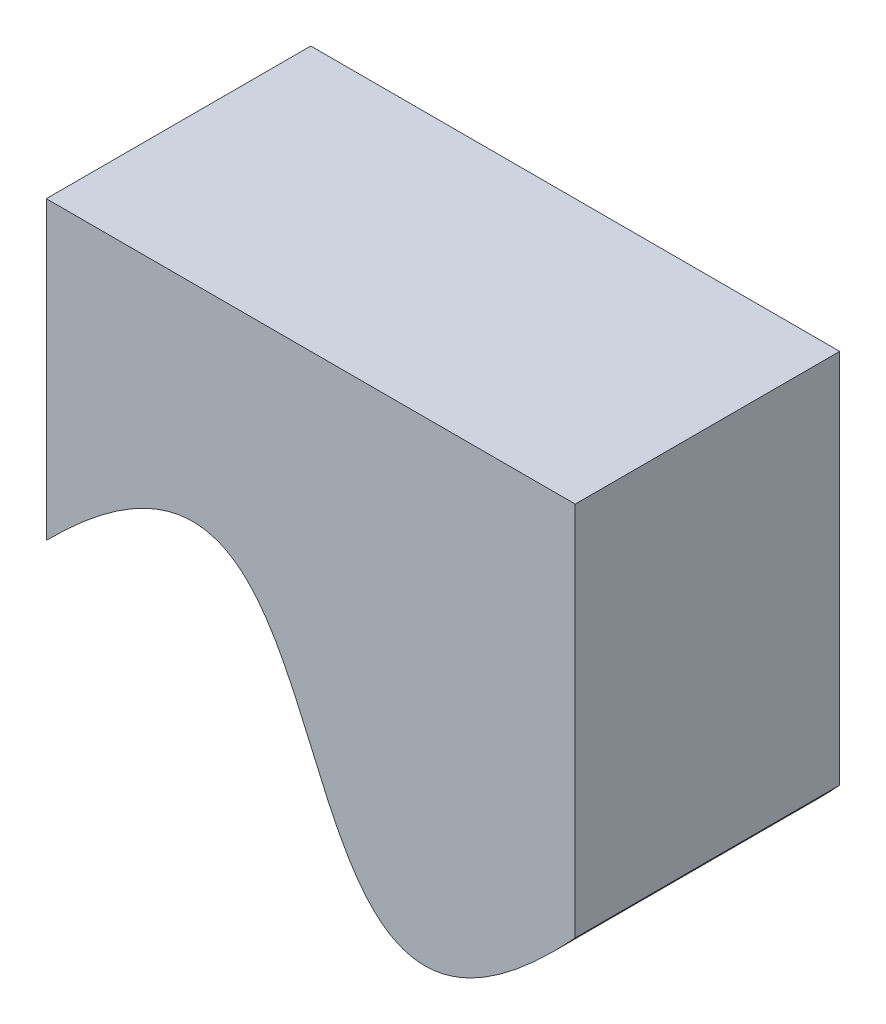
ISO-10303-21;
HEADER;
FILE_DESCRIPTION(('STEP AP214'),'2;1');
FILE_NAME('part.step','',(''),(''),'','','');
FILE_SCHEMA(('AUTOMOTIVE_DESIGN { 1 0 10303 214 1 1 1 1 }'));
ENDSEC;
DATA;
#1=APPLICATION_CONTEXT('core data for automotive mechanical design processes');
#2=APPLICATION_PROTOCOL_DEFINITION('international standard','automotive_design',2000,#1);
#3=PRODUCT_CONTEXT('',#1,'mechanical');
#4=PRODUCT('Part','Part','',(#3));
#5=PRODUCT_RELATED_PRODUCT_CATEGORY('part','',(#4));
#6=PRODUCT_DEFINITION_FORMATION('','',#4);
#7=PRODUCT_DEFINITION_CONTEXT('part definition',#1,'design');
#8=PRODUCT_DEFINITION('design','',#6,#7);
#9=PRODUCT_DEFINITION_SHAPE('','',#8);
#10=(LENGTH_UNIT() NAMED_UNIT(*) SI_UNIT(.MILLI.,.METRE.));
#11=(NAMED_UNIT(*) PLANE_ANGLE_UNIT() SI_UNIT($,.RADIAN.));
#12=(NAMED_UNIT(*) SI_UNIT($,.STERADIAN.) SOLID_ANGLE_UNIT());
#13=UNCERTAINTY_MEASURE_WITH_UNIT(LENGTH_MEASURE(1.E-05),#10,'distance_accuracy_value','');
#14=(GEOMETRIC_REPRESENTATION_CONTEXT(3) GLOBAL_UNCERTAINTY_ASSIGNED_CONTEXT((#13)) GLOBAL_UNIT_ASSIGNED_CONTEXT((#10,
#11,#12)) REPRESENTATION_CONTEXT('',''));
#15=CARTESIAN_POINT('',(0.,0.,0.));
#16=DIRECTION('',(0.,0.,1.));
#17=DIRECTION('',(1.,0.,0.));
#18=AXIS2_PLACEMENT_3D('',#15,#16,#17);
#19=CARTESIAN_POINT('',(0.,37.6158513088853,-0.00999999999999959));
#20=CARTESIAN_POINT('',(25.7925453870106,63.7832565901815,-0.00999999999999959));
#21=CARTESIAN_POINT('',(14.3856436401245,3.83829210486628,-0.00999999999999959));
#22=CARTESIAN_POINT('',(40.,31.5893405988277,-0.00999999999999959));
#23=B_SPLINE_CURVE_WITH_KNOTS('',3,(#19,#20,#21,#22),.UNSPECIFIED.,.F.,.F.,(4,4),(0.,1.),.UNSPECIFIED.);
#24=DIRECTION('',(0.,0.,1.));
#25=VECTOR('',#24,1.);
#26=SURFACE_OF_LINEAR_EXTRUSION('',#23,#25);
#27=DIRECTION('',(0.,0.,1.));
#28=VECTOR('',#27,1.);
#29=CARTESIAN_POINT('',(0.,37.6158513088853,-0.00999999999999959));
#30=LINE('',#29,#28);
#31=CARTESIAN_POINT('',(0.,37.6158513088853,0.));
#32=VERTEX_POINT('',#31);
#33=CARTESIAN_POINT('',(0.,37.6158513088853,20.));
#34=VERTEX_POINT('',#33);
#35=EDGE_CURVE('E95',#32,#34,#30,.T.);
#36=ORIENTED_EDGE('',*,*,#35,.F.);
#37=CARTESIAN_POINT('',(0.,37.6158513088853,0.));
#38=CARTESIAN_POINT('',(25.7925453870106,63.7832565901815,0.));
#39=CARTESIAN_POINT('',(14.3856436401245,3.83829210486628,0.));
#40=CARTESIAN_POINT('',(40.,31.5893405988277,0.));
#41=B_SPLINE_CURVE_WITH_KNOTS('',3,(#37,#38,#39,#40),.UNSPECIFIED.,.F.,.F.,(4,4),(0.,1.),.UNSPECIFIED.);
#42=CARTESIAN_POINT('',(40.,31.5893405988277,0.));
#43=VERTEX_POINT('',#42);
#44=EDGE_CURVE('E88',#32,#43,#41,.T.);
#45=ORIENTED_EDGE('',*,*,#44,.T.);
#46=DIRECTION('',(0.,0.,1.));
#47=VECTOR('',#46,1.);
#48=CARTESIAN_POINT('',(40.,31.5893405988277,-0.00999999999999959));
#49=LINE('',#48,#47);
#50=CARTESIAN_POINT('',(40.,31.5893405988277,20.));
#51=VERTEX_POINT('',#50);
#52=EDGE_CURVE('E92',#43,#51,#49,.T.);
#53=ORIENTED_EDGE('',*,*,#52,.T.);
#54=CARTESIAN_POINT('',(0.,37.6158513088853,20.));
#55=CARTESIAN_POINT('',(25.7925453870106,63.7832565901815,20.));
#56=CARTESIAN_POINT('',(14.3856436401245,3.83829210486628,20.));
#57=CARTESIAN_POINT('',(40.,31.5893405988277,20.));
#58=B_SPLINE_CURVE_WITH_KNOTS('',3,(#54,#55,#56,#57),.UNSPECIFIED.,.F.,.F.,(4,4),(0.,1.),.UNSPECIFIED.);
#59=EDGE_CURVE('E77',#34,#51,#58,.T.);
#60=ORIENTED_EDGE('',*,*,#59,.F.);
#61=EDGE_LOOP('',(#36,#45,#53,#60));
#62=FACE_BOUND('',#61,.T.);
#63=ADVANCED_FACE('F36',(#62),#26,.T.);
#64=CARTESIAN_POINT('',(40.,0.,20.));
#65=DIRECTION('',(-1.,0.,0.));
#66=DIRECTION('',(0.,0.,1.));
#67=AXIS2_PLACEMENT_3D('',#64,#65,#66);
#68=PLANE('',#67);
#69=ORIENTED_EDGE('',*,*,#52,.F.);
#70=DIRECTION('',(0.,1.,0.));
#71=VECTOR('',#70,1.);
#72=CARTESIAN_POINT('',(40.,0.,0.));
#73=LINE('',#72,#71);
#74=CARTESIAN_POINT('',(40.,60.,0.));
#75=VERTEX_POINT('',#74);
#76=EDGE_CURVE('E48',#43,#75,#73,.T.);
#77=ORIENTED_EDGE('',*,*,#76,.T.);
#78=DIRECTION('',(0.,0.,-1.));
#79=VECTOR('',#78,1.);
#80=CARTESIAN_POINT('',(40.,60.,20.));
#81=LINE('',#80,#79);
#82=CARTESIAN_POINT('',(40.,60.,20.));
#83=VERTEX_POINT('',#82);
#84=EDGE_CURVE('E106',#83,#75,#81,.T.);
#85=ORIENTED_EDGE('',*,*,#84,.F.);
#86=DIRECTION('',(0.,1.,0.));
#87=VECTOR('',#86,1.);
#88=CARTESIAN_POINT('',(40.,0.,20.));
#89=LINE('',#88,#87);
#90=EDGE_CURVE('E94',#51,#83,#89,.T.);
#91=ORIENTED_EDGE('',*,*,#90,.F.);
#92=EDGE_LOOP('',(#69,#77,#85,#91));
#93=FACE_BOUND('',#92,.T.);
#94=ADVANCED_FACE('F93',(#93),#68,.F.);
#95=CARTESIAN_POINT('',(0.,60.,20.));
#96=DIRECTION('',(0.,1.,0.));
#97=DIRECTION('',(0.,0.,1.));
#98=AXIS2_PLACEMENT_3D('',#95,#96,#97);
#99=PLANE('',#98);
#100=DIRECTION('',(1.,0.,0.));
#101=VECTOR('',#100,1.);
#102=CARTESIAN_POINT('',(0.,60.,0.));
#103=LINE('',#102,#101);
#104=CARTESIAN_POINT('',(0.,60.,0.));
#105=VERTEX_POINT('',#104);
#106=EDGE_CURVE('E11',#105,#75,#103,.T.);
#107=ORIENTED_EDGE('',*,*,#106,.F.);
#108=DIRECTION('',(0.,0.,-1.));
#109=VECTOR('',#108,1.);
#110=CARTESIAN_POINT('',(0.,60.,20.));
#111=LINE('',#110,#109);
#112=CARTESIAN_POINT('',(0.,60.,20.));
#113=VERTEX_POINT('',#112);
#114=EDGE_CURVE('E117',#113,#105,#111,.T.);
#115=ORIENTED_EDGE('',*,*,#114,.F.);
#116=DIRECTION('',(1.,0.,0.));
#117=VECTOR('',#116,1.);
#118=CARTESIAN_POINT('',(0.,60.,20.));
#119=LINE('',#118,#117);
#120=EDGE_CURVE('E108',#113,#83,#119,.T.);
#121=ORIENTED_EDGE('',*,*,#120,.T.);
#122=ORIENTED_EDGE('',*,*,#84,.T.);
#123=EDGE_LOOP('',(#107,#115,#121,#122));
#124=FACE_BOUND('',#123,.T.);
#125=ADVANCED_FACE('F124',(#124),#99,.T.);
#126=CARTESIAN_POINT('',(0.,0.,20.));
#127=DIRECTION('',(-1.,0.,0.));
#128=DIRECTION('',(0.,0.,1.));
#129=AXIS2_PLACEMENT_3D('',#126,#127,#128);
#130=PLANE('',#129);
#131=DIRECTION('',(0.,1.,0.));
#132=VECTOR('',#131,1.);
#133=CARTESIAN_POINT('',(0.,0.,0.));
#134=LINE('',#133,#132);
#135=EDGE_CURVE('E90',#32,#105,#134,.T.);
#136=ORIENTED_EDGE('',*,*,#135,.F.);
#137=ORIENTED_EDGE('',*,*,#35,.T.);
#138=DIRECTION('',(0.,1.,0.));
#139=VECTOR('',#138,1.);
#140=CARTESIAN_POINT('',(0.,0.,20.));
#141=LINE('',#140,#139);
#142=EDGE_CURVE('E68',#34,#113,#141,.T.);
#143=ORIENTED_EDGE('',*,*,#142,.T.);
#144=ORIENTED_EDGE('',*,*,#114,.T.);
#145=EDGE_LOOP('',(#136,#137,#143,#144));
#146=FACE_BOUND('',#145,.T.);
#147=ADVANCED_FACE('F121',(#146),#130,.T.);
#148=CARTESIAN_POINT('',(0.,0.,0.));
#149=DIRECTION('',(0.,0.,1.));
#150=DIRECTION('',(1.,0.,0.));
#151=AXIS2_PLACEMENT_3D('',#148,#149,#150);
#152=PLANE('',#151);
#153=ORIENTED_EDGE('',*,*,#44,.F.);
#154=ORIENTED_EDGE('',*,*,#135,.T.);
#155=ORIENTED_EDGE('',*,*,#106,.T.);
#156=ORIENTED_EDGE('',*,*,#76,.F.);
#157=EDGE_LOOP('',(#153,#154,#155,#156));
#158=FACE_BOUND('',#157,.T.);
#159=ADVANCED_FACE('F86',(#158),#152,.F.);
#160=CARTESIAN_POINT('',(0.,0.,20.));
#161=DIRECTION('',(0.,0.,1.));
#162=DIRECTION('',(1.,0.,0.));
#163=AXIS2_PLACEMENT_3D('',#160,#161,#162);
#164=PLANE('',#163);
#165=ORIENTED_EDGE('',*,*,#142,.F.);
#166=ORIENTED_EDGE('',*,*,#59,.T.);
#167=ORIENTED_EDGE('',*,*,#90,.T.);
#168=ORIENTED_EDGE('',*,*,#120,.F.);
#169=EDGE_LOOP('',(#165,#166,#167,#168));
#170=FACE_BOUND('',#169,.T.);
#171=ADVANCED_FACE('F38',(#170),#164,.T.);
#172=CLOSED_SHELL('',(#63,#94,#125,#147,#159,#171));
#173=MANIFOLD_SOLID_BREP('B2',#172);
#174=ADVANCED_BREP_SHAPE_REPRESENTATION('',(#18,#173),#14);
#175=SHAPE_DEFINITION_REPRESENTATION(#9,#174);
ENDSEC;
END-ISO-10303-21;
